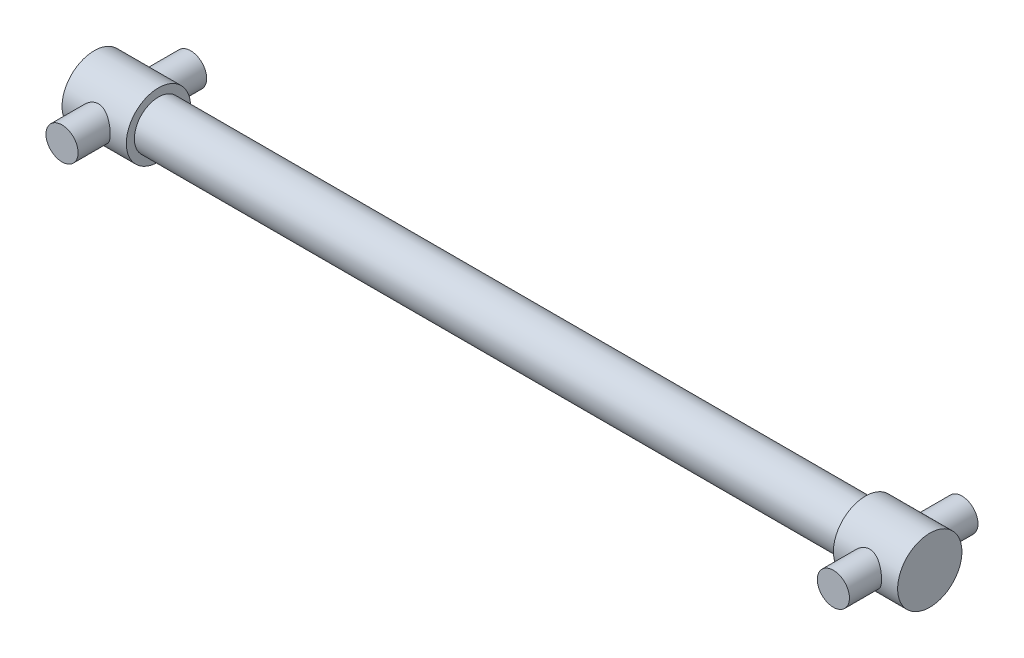
ISO-10303-21;
HEADER;
FILE_DESCRIPTION(('STEP AP214'),'2;1');
FILE_NAME('part.step','',(''),(''),'','','');
FILE_SCHEMA(('AUTOMOTIVE_DESIGN { 1 0 10303 214 1 1 1 1 }'));
ENDSEC;
DATA;
#1=APPLICATION_CONTEXT('core data for automotive mechanical design processes');
#2=APPLICATION_PROTOCOL_DEFINITION('international standard','automotive_design',2000,#1);
#3=PRODUCT_CONTEXT('',#1,'mechanical');
#4=PRODUCT('Part','Part','',(#3));
#5=PRODUCT_RELATED_PRODUCT_CATEGORY('part','',(#4));
#6=PRODUCT_DEFINITION_FORMATION('','',#4);
#7=PRODUCT_DEFINITION_CONTEXT('part definition',#1,'design');
#8=PRODUCT_DEFINITION('design','',#6,#7);
#9=PRODUCT_DEFINITION_SHAPE('','',#8);
#10=(LENGTH_UNIT() NAMED_UNIT(*) SI_UNIT(.MILLI.,.METRE.));
#11=(NAMED_UNIT(*) PLANE_ANGLE_UNIT() SI_UNIT($,.RADIAN.));
#12=(NAMED_UNIT(*) SI_UNIT($,.STERADIAN.) SOLID_ANGLE_UNIT());
#13=UNCERTAINTY_MEASURE_WITH_UNIT(LENGTH_MEASURE(1.E-05),#10,'distance_accuracy_value','');
#14=(GEOMETRIC_REPRESENTATION_CONTEXT(3) GLOBAL_UNCERTAINTY_ASSIGNED_CONTEXT((#13)) GLOBAL_UNIT_ASSIGNED_CONTEXT((#10,
#11,#12)) REPRESENTATION_CONTEXT('',''));
#15=CARTESIAN_POINT('',(0.,0.,0.));
#16=DIRECTION('',(0.,0.,1.));
#17=DIRECTION('',(1.,0.,0.));
#18=AXIS2_PLACEMENT_3D('',#15,#16,#17);
#19=CARTESIAN_POINT('',(52.,0.,0.));
#20=DIRECTION('',(-1.,0.,0.));
#21=DIRECTION('',(0.,0.,1.));
#22=AXIS2_PLACEMENT_3D('',#19,#20,#21);
#23=CYLINDRICAL_SURFACE('',#22,1.5);
#24=CARTESIAN_POINT('',(48.,0.,0.));
#25=DIRECTION('',(1.,0.,0.));
#26=DIRECTION('',(0.,0.,-1.));
#27=AXIS2_PLACEMENT_3D('',#24,#25,#26);
#28=CIRCLE('',#27,1.5);
#29=CARTESIAN_POINT('',(48.,0.,1.5));
#30=VERTEX_POINT('',#29);
#31=EDGE_CURVE('E115',#30,#30,#28,.T.);
#32=CARTESIAN_POINT('',(4.,0.,0.));
#33=DIRECTION('',(-1.,0.,0.));
#34=DIRECTION('',(0.,0.,1.));
#35=AXIS2_PLACEMENT_3D('',#32,#33,#34);
#36=CIRCLE('',#35,1.5);
#37=CARTESIAN_POINT('',(4.,0.,1.5));
#38=VERTEX_POINT('',#37);
#39=EDGE_CURVE('E89',#38,#38,#36,.T.);
#40=CARTESIAN_POINT('',(48.,0.,1.5));
#41=CARTESIAN_POINT('',(47.5416666666667,0.,1.5));
#42=CARTESIAN_POINT('',(47.0833333333333,0.,1.5));
#43=CARTESIAN_POINT('',(46.1666666666667,0.,1.5));
#44=CARTESIAN_POINT('',(45.7083333333333,0.,1.5));
#45=CARTESIAN_POINT('',(44.7916666666667,0.,1.5));
#46=CARTESIAN_POINT('',(44.3333333333333,0.,1.5));
#47=CARTESIAN_POINT('',(43.4166666666667,0.,1.5));
#48=CARTESIAN_POINT('',(42.9583333333333,0.,1.5));
#49=CARTESIAN_POINT('',(42.0416666666667,0.,1.5));
#50=CARTESIAN_POINT('',(41.5833333333333,0.,1.5));
#51=CARTESIAN_POINT('',(40.6666666666667,0.,1.5));
#52=CARTESIAN_POINT('',(40.2083333333333,0.,1.5));
#53=CARTESIAN_POINT('',(39.2916666666667,0.,1.5));
#54=CARTESIAN_POINT('',(38.8333333333333,0.,1.5));
#55=CARTESIAN_POINT('',(37.9166666666667,0.,1.5));
#56=CARTESIAN_POINT('',(37.4583333333333,0.,1.5));
#57=CARTESIAN_POINT('',(36.5416666666667,0.,1.5));
#58=CARTESIAN_POINT('',(36.0833333333333,0.,1.5));
#59=CARTESIAN_POINT('',(35.1666666666667,0.,1.5));
#60=CARTESIAN_POINT('',(34.7083333333333,0.,1.5));
#61=CARTESIAN_POINT('',(33.7916666666667,0.,1.5));
#62=CARTESIAN_POINT('',(33.3333333333333,0.,1.5));
#63=CARTESIAN_POINT('',(32.4166666666667,0.,1.5));
#64=CARTESIAN_POINT('',(31.9583333333333,0.,1.5));
#65=CARTESIAN_POINT('',(31.0416666666667,0.,1.5));
#66=CARTESIAN_POINT('',(30.5833333333333,0.,1.5));
#67=CARTESIAN_POINT('',(29.6666666666667,0.,1.5));
#68=CARTESIAN_POINT('',(29.2083333333333,0.,1.5));
#69=CARTESIAN_POINT('',(28.2916666666667,0.,1.5));
#70=CARTESIAN_POINT('',(27.8333333333333,0.,1.5));
#71=CARTESIAN_POINT('',(26.9166666666667,0.,1.5));
#72=CARTESIAN_POINT('',(26.4583333333333,0.,1.5));
#73=CARTESIAN_POINT('',(25.5416666666667,0.,1.5));
#74=CARTESIAN_POINT('',(25.0833333333333,0.,1.5));
#75=CARTESIAN_POINT('',(24.1666666666667,0.,1.5));
#76=CARTESIAN_POINT('',(23.7083333333333,0.,1.5));
#77=CARTESIAN_POINT('',(22.7916666666667,0.,1.5));
#78=CARTESIAN_POINT('',(22.3333333333333,0.,1.5));
#79=CARTESIAN_POINT('',(21.4166666666667,0.,1.5));
#80=CARTESIAN_POINT('',(20.9583333333333,0.,1.5));
#81=CARTESIAN_POINT('',(20.0416666666667,0.,1.5));
#82=CARTESIAN_POINT('',(19.5833333333333,0.,1.5));
#83=CARTESIAN_POINT('',(18.6666666666667,0.,1.5));
#84=CARTESIAN_POINT('',(18.2083333333333,0.,1.5));
#85=CARTESIAN_POINT('',(17.2916666666667,0.,1.5));
#86=CARTESIAN_POINT('',(16.8333333333333,0.,1.5));
#87=CARTESIAN_POINT('',(15.9166666666667,0.,1.5));
#88=CARTESIAN_POINT('',(15.4583333333333,0.,1.5));
#89=CARTESIAN_POINT('',(14.5416666666667,0.,1.5));
#90=CARTESIAN_POINT('',(14.0833333333333,0.,1.5));
#91=CARTESIAN_POINT('',(13.1666666666667,0.,1.5));
#92=CARTESIAN_POINT('',(12.7083333333333,0.,1.5));
#93=CARTESIAN_POINT('',(11.7916666666667,0.,1.5));
#94=CARTESIAN_POINT('',(11.3333333333333,0.,1.5));
#95=CARTESIAN_POINT('',(10.4166666666667,0.,1.5));
#96=CARTESIAN_POINT('',(9.95833333333333,0.,1.5));
#97=CARTESIAN_POINT('',(9.04166666666667,0.,1.5));
#98=CARTESIAN_POINT('',(8.58333333333333,0.,1.5));
#99=CARTESIAN_POINT('',(7.66666666666667,0.,1.5));
#100=CARTESIAN_POINT('',(7.20833333333334,0.,1.5));
#101=CARTESIAN_POINT('',(6.29166666666667,0.,1.5));
#102=CARTESIAN_POINT('',(5.83333333333334,0.,1.5));
#103=CARTESIAN_POINT('',(4.91666666666667,0.,1.5));
#104=CARTESIAN_POINT('',(4.45833333333334,0.,1.5));
#105=CARTESIAN_POINT('',(4.,0.,1.5));
#106=B_SPLINE_CURVE_WITH_KNOTS('',3,(#40,#41,#42,#43,#44,#45,#46,#47,#48,#49,#50,#51,#52,#53,
#54,#55,#56,#57,#58,#59,#60,#61,#62,#63,#64,#65,#66,#67,#68,#69,#70,#71,#72,#73,#74,#75,#76,#77,
#78,#79,#80,#81,#82,#83,#84,#85,#86,#87,#88,#89,#90,#91,#92,#93,#94,#95,#96,#97,#98,#99,#100,
#101,#102,#103,#104,#105),.UNSPECIFIED.,.F.,.F.,(4,2,2,2,2,2,2,2,2,2,2,2,2,2,2,2,2,2,2,2,2,2,2,
2,2,2,2,2,2,2,2,2,4),(0.,1.37499999999999,2.75,4.125,5.5,6.875,8.25,9.62499999999999,11.,12.375,
13.75,15.125,16.5,17.875,19.25,20.625,22.,23.375,24.75,26.125,27.5,28.875,30.25,31.625,33.,
34.375,35.75,37.125,38.5,39.875,41.25,42.625,44.),.UNSPECIFIED.);
#107=EDGE_CURVE('BSEAM30',#30,#38,#106,.T.);
#108=ORIENTED_EDGE('',*,*,#31,.F.);
#109=ORIENTED_EDGE('',*,*,#39,.F.);
#110=ORIENTED_EDGE('',*,*,#107,.T.);
#111=ORIENTED_EDGE('',*,*,#107,.F.);
#112=EDGE_LOOP('',(#108,#110,#109,#111));
#113=FACE_BOUND('',#112,.T.);
#114=ADVANCED_FACE('F30',(#113),#23,.T.);
#115=CARTESIAN_POINT('',(48.,0.,0.));
#116=DIRECTION('',(1.,0.,0.));
#117=DIRECTION('',(0.,0.,-1.));
#118=AXIS2_PLACEMENT_3D('',#115,#116,#117);
#119=CYLINDRICAL_SURFACE('',#118,2.);
#120=CARTESIAN_POINT('',(49.,0.,-2.));
#121=CARTESIAN_POINT('',(49.0000033023195,0.0525719629529863,-1.99999713404151));
#122=CARTESIAN_POINT('',(49.0041700731217,0.105206599698032,-1.99790491019518));
#123=CARTESIAN_POINT('',(49.0206528803409,0.208920235268425,-1.98974156037396));
#124=CARTESIAN_POINT('',(49.0329843929976,0.259996086713504,-1.98366287828984));
#125=CARTESIAN_POINT('',(49.0651938086168,0.358933544880574,-1.96816279403312));
#126=CARTESIAN_POINT('',(49.085042384248,0.406806802939179,-1.9587543917752));
#127=CARTESIAN_POINT('',(49.1315706213649,0.498472616806563,-1.93745776515779));
#128=CARTESIAN_POINT('',(49.1582497442488,0.542265493990048,-1.9255697363353));
#129=CARTESIAN_POINT('',(49.2195172494853,0.627507817761918,-1.89956258258057));
#130=CARTESIAN_POINT('',(49.2544864792396,0.66865521112211,-1.88535199127536));
#131=CARTESIAN_POINT('',(49.330521479247,0.744779444866975,-1.85659970246744));
#132=CARTESIAN_POINT('',(49.3715918517724,0.779751583106766,-1.84205776209035));
#133=CARTESIAN_POINT('',(49.4624833495234,0.845252000450277,-1.81298951197347));
#134=CARTESIAN_POINT('',(49.5127360983459,0.875225335551633,-1.79855186970132));
#135=CARTESIAN_POINT('',(49.6183673359862,0.926168226890691,-1.77285978772321));
#136=CARTESIAN_POINT('',(49.6737421287228,0.94714421496633,-1.7616030760699));
#137=CARTESIAN_POINT('',(49.7846651054219,0.978132442188585,-1.74457867037809));
#138=CARTESIAN_POINT('',(49.8400044520674,0.988725857080438,-1.73852271583714));
#139=CARTESIAN_POINT('',(49.9519788377795,1.00042699330884,-1.73181889948528));
#140=CARTESIAN_POINT('',(50.0086125408711,1.00154408837307,-1.73116569343288));
#141=CARTESIAN_POINT('',(50.1142860243154,0.994687287172293,-1.73510930257249));
#142=CARTESIAN_POINT('',(50.163424031223,0.987784559536821,-1.73908763662014));
#143=CARTESIAN_POINT('',(50.259721909373,0.966939849056932,-1.7507622873385));
#144=CARTESIAN_POINT('',(50.3068811453053,0.95299562389765,-1.75845978831776));
#145=CARTESIAN_POINT('',(50.3992291325657,0.918209780386001,-1.77687476412741));
#146=CARTESIAN_POINT('',(50.4443463987858,0.897215067115992,-1.78765840663999));
#147=CARTESIAN_POINT('',(50.53063429259,0.849041687668,-1.81103404281404));
#148=CARTESIAN_POINT('',(50.5718031356001,0.821860243812465,-1.82362684780191));
#149=CARTESIAN_POINT('',(50.6545212527432,0.758066054912787,-1.85113157903286));
#150=CARTESIAN_POINT('',(50.6954568735761,0.720694458369282,-1.86613510236746));
#151=CARTESIAN_POINT('',(50.7707354185909,0.639555578741376,-1.89547623300407));
#152=CARTESIAN_POINT('',(50.8050751920339,0.595785256574287,-1.90981351958801));
#153=CARTESIAN_POINT('',(50.8676856610297,0.500516505831849,-1.93701987282964));
#154=CARTESIAN_POINT('',(50.8956004724457,0.448753591599409,-1.94978984162007));
#155=CARTESIAN_POINT('',(50.942097029043,0.340466215488798,-1.97157881121242));
#156=CARTESIAN_POINT('',(50.9606861850152,0.283945576265278,-1.98060078943553));
#157=CARTESIAN_POINT('',(50.9864754037167,0.172766491660704,-1.99324333741436));
#158=CARTESIAN_POINT('',(50.9944912357468,0.118341530548326,-1.99724938301312));
#159=CARTESIAN_POINT('',(51.0014647311345,0.00877959994935483,-2.00073013459102));
#160=CARTESIAN_POINT('',(51.0004266856395,-0.0463570198699006,-2.00020698721312));
#161=CARTESIAN_POINT('',(50.9897933115812,-0.151232971985993,-1.99491192253441));
#162=CARTESIAN_POINT('',(50.98086746727,-0.201059408049954,-1.9904724568819));
#163=CARTESIAN_POINT('',(50.9557619281049,-0.298406892301916,-1.97822171314819));
#164=CARTESIAN_POINT('',(50.9395814335466,-0.345927685690995,-1.97041006334332));
#165=CARTESIAN_POINT('',(50.9000015335668,-0.438888608449664,-1.95184251413669));
#166=CARTESIAN_POINT('',(50.8764089498832,-0.484230397006153,-1.94100881769939));
#167=CARTESIAN_POINT('',(50.822892464354,-0.57046136169892,-1.91743974317109));
#168=CARTESIAN_POINT('',(50.7929658654066,-0.611348629775279,-1.90470355565785));
#169=CARTESIAN_POINT('',(50.7242395746671,-0.691767689290649,-1.87708221337465));
#170=CARTESIAN_POINT('',(50.6848571315464,-0.730772077824635,-1.86210884848441));
#171=CARTESIAN_POINT('',(50.6000748487307,-0.801856321113236,-1.83262391603875));
#172=CARTESIAN_POINT('',(50.5546708811836,-0.833931385690837,-1.81811267381527));
#173=CARTESIAN_POINT('',(50.4563563457997,-0.891707914497692,-1.79051192226068));
#174=CARTESIAN_POINT('',(50.4031887337914,-0.917025495878634,-1.77752529663472));
#175=CARTESIAN_POINT('',(50.2924899323075,-0.958082826013801,-1.75574072368126));
#176=CARTESIAN_POINT('',(50.2349644734988,-0.973834915887568,-1.74693738240618));
#177=CARTESIAN_POINT('',(50.1230897771385,-0.993861687449677,-1.73561501008667));
#178=CARTESIAN_POINT('',(50.068965746571,-0.999092996400863,-1.73257383460491));
#179=CARTESIAN_POINT('',(49.9605529328293,-1.00068915438078,-1.73165354646175));
#180=CARTESIAN_POINT('',(49.9062642312606,-0.997057846624396,-1.73377219627553));
#181=CARTESIAN_POINT('',(49.804516498468,-0.98192612559226,-1.74237862050025));
#182=CARTESIAN_POINT('',(49.7568995298556,-0.971208314342796,-1.74843094482394));
#183=CARTESIAN_POINT('',(49.6641918805753,-0.943175358224643,-1.76371016187918));
#184=CARTESIAN_POINT('',(49.619102017908,-0.925858091159809,-1.77293807569676));
#185=CARTESIAN_POINT('',(49.5293751490134,-0.883815745300679,-1.79428530364528));
#186=CARTESIAN_POINT('',(49.4849720981703,-0.858671137816451,-1.80655722396191));
#187=CARTESIAN_POINT('',(49.4007254638194,-0.802150971636627,-1.83235331634591));
#188=CARTESIAN_POINT('',(49.3608842694815,-0.770772171238644,-1.84587813794522));
#189=CARTESIAN_POINT('',(49.2818580176424,-0.698203326664641,-1.87462323159313));
#190=CARTESIAN_POINT('',(49.2433408976381,-0.656284423010171,-1.88984983311469));
#191=CARTESIAN_POINT('',(49.1737370165764,-0.566154806220278,-1.91877752255088));
#192=CARTESIAN_POINT('',(49.1426542605737,-0.517940723256783,-1.9324777860804));
#193=CARTESIAN_POINT('',(49.0887636372378,-0.415931596819943,-1.95698009585103));
#194=CARTESIAN_POINT('',(49.0660158305886,-0.36209950393461,-1.96776096562909));
#195=CARTESIAN_POINT('',(49.030191832081,-0.250742101294186,-1.98501341363466));
#196=CARTESIAN_POINT('',(49.0170881531704,-0.193227799623161,-1.99149723372932));
#197=CARTESIAN_POINT('',(49.0061025889242,-0.11260194648338,-1.99695461909663));
#198=CARTESIAN_POINT('',(49.0038173591364,-0.0901618794394953,-1.99809365339202));
#199=CARTESIAN_POINT('',(49.0007653344832,-0.0451517318071558,-1.99961696977865));
#200=CARTESIAN_POINT('',(48.9999985815288,-0.0225816476473804,-2.00000123103763));
#201=CARTESIAN_POINT('',(49.,0.,-2.));
#202=B_SPLINE_CURVE_WITH_KNOTS('',3,(#120,#121,#122,#123,#124,#125,#126,#127,#128,#129,#130,
#131,#132,#133,#134,#135,#136,#137,#138,#139,#140,#141,#142,#143,#144,#145,#146,#147,#148,#149,
#150,#151,#152,#153,#154,#155,#156,#157,#158,#159,#160,#161,#162,#163,#164,#165,#166,#167,#168,
#169,#170,#171,#172,#173,#174,#175,#176,#177,#178,#179,#180,#181,#182,#183,#184,#185,#186,#187,
#188,#189,#190,#191,#192,#193,#194,#195,#196,#197,#198,#199,#200,#201),.UNSPECIFIED.,.T.,.F.,(4,
2,2,2,2,2,2,2,2,2,2,2,2,2,2,2,2,2,2,2,2,2,2,2,2,2,2,2,2,2,2,2,2,2,2,2,2,2,2,2,4),(0.,
0.157624257420292,0.315548149709196,0.472862155492299,0.630163760581564,0.79698175871809,
0.963926237654031,1.14381726430752,1.32357947898281,1.49258012140228,1.66141357329019,
1.8100571240932,1.95874803925678,2.11090240168487,2.26312521260221,2.43464941333877,
2.60625534598685,2.7858302221444,2.96526216912279,3.12983290471345,3.29432564511475,
3.44606906506121,3.59782921630931,3.75392856027898,3.91009450748338,4.08159610644417,
4.2532158861543,4.43314682159673,4.61284511940776,4.77529307498373,4.93767059860004,
5.08457930244181,5.23153528783677,5.38836456775614,5.54527561138956,5.72125242752497,
5.89732383376572,6.07464013662924,6.25144908624929,6.31915280137696,6.38685838514845),.UNSPECIFIED.);
#203=CARTESIAN_POINT('',(49.,0.,-2.));
#204=VERTEX_POINT('',#203);
#205=EDGE_CURVE('E44',#204,#204,#202,.T.);
#206=ORIENTED_EDGE('',*,*,#205,.F.);
#207=EDGE_LOOP('',(#206));
#208=FACE_BOUND('',#207,.T.);
#209=CARTESIAN_POINT('',(51.,0.,2.));
#210=CARTESIAN_POINT('',(50.9999966976805,0.0525719629529863,1.99999713404151));
#211=CARTESIAN_POINT('',(50.9958299268783,0.105206599698032,1.99790491019518));
#212=CARTESIAN_POINT('',(50.9793471196591,0.208920235268425,1.98974156037396));
#213=CARTESIAN_POINT('',(50.9670156070023,0.259996086713504,1.98366287828984));
#214=CARTESIAN_POINT('',(50.9348061913832,0.358933544880574,1.96816279403312));
#215=CARTESIAN_POINT('',(50.914957615752,0.406806802939179,1.9587543917752));
#216=CARTESIAN_POINT('',(50.8684293786351,0.498472616806563,1.93745776515779));
#217=CARTESIAN_POINT('',(50.8417502557511,0.542265493990048,1.9255697363353));
#218=CARTESIAN_POINT('',(50.7804827505147,0.627507817761918,1.89956258258057));
#219=CARTESIAN_POINT('',(50.7455135207603,0.66865521112211,1.88535199127536));
#220=CARTESIAN_POINT('',(50.669478520753,0.744779444866975,1.85659970246744));
#221=CARTESIAN_POINT('',(50.6284081482276,0.779751583106765,1.84205776209035));
#222=CARTESIAN_POINT('',(50.5375166504766,0.845252000450278,1.81298951197347));
#223=CARTESIAN_POINT('',(50.4872639016541,0.875225335551636,1.79855186970132));
#224=CARTESIAN_POINT('',(50.3816326640138,0.926168226890693,1.77285978772321));
#225=CARTESIAN_POINT('',(50.3262578712772,0.947144214966331,1.7616030760699));
#226=CARTESIAN_POINT('',(50.2153348945781,0.978132442188585,1.74457867037809));
#227=CARTESIAN_POINT('',(50.1599955479326,0.988725857080439,1.73852271583714));
#228=CARTESIAN_POINT('',(50.0480211622205,1.00042699330884,1.73181889948528));
#229=CARTESIAN_POINT('',(49.9913874591289,1.00154408837307,1.73116569343288));
#230=CARTESIAN_POINT('',(49.8857139756846,0.994687287172293,1.73510930257249));
#231=CARTESIAN_POINT('',(49.8365759687769,0.987784559536821,1.73908763662014));
#232=CARTESIAN_POINT('',(49.740278090627,0.966939849056932,1.7507622873385));
#233=CARTESIAN_POINT('',(49.6931188546947,0.95299562389765,1.75845978831776));
#234=CARTESIAN_POINT('',(49.6007708674343,0.918209780386001,1.77687476412741));
#235=CARTESIAN_POINT('',(49.5556536012142,0.897215067115992,1.78765840663999));
#236=CARTESIAN_POINT('',(49.46936570741,0.849041687668,1.81103404281404));
#237=CARTESIAN_POINT('',(49.4281968643999,0.821860243812465,1.82362684780191));
#238=CARTESIAN_POINT('',(49.3454787472568,0.758066054912787,1.85113157903286));
#239=CARTESIAN_POINT('',(49.3045431264238,0.720694458369282,1.86613510236746));
#240=CARTESIAN_POINT('',(49.2292645814091,0.639555578741376,1.89547623300407));
#241=CARTESIAN_POINT('',(49.1949248079661,0.595785256574287,1.90981351958801));
#242=CARTESIAN_POINT('',(49.1323143389703,0.500516505831849,1.93701987282964));
#243=CARTESIAN_POINT('',(49.1043995275543,0.448753591599409,1.94978984162007));
#244=CARTESIAN_POINT('',(49.057902970957,0.340466215488798,1.97157881121242));
#245=CARTESIAN_POINT('',(49.0393138149848,0.283945576265278,1.98060078943553));
#246=CARTESIAN_POINT('',(49.0135245962833,0.172766491660704,1.99324333741436));
#247=CARTESIAN_POINT('',(49.0055087642532,0.118341530548326,1.99724938301312));
#248=CARTESIAN_POINT('',(48.9985352688655,0.00877959994935484,2.00073013459102));
#249=CARTESIAN_POINT('',(48.9995733143605,-0.0463570198699005,2.00020698721312));
#250=CARTESIAN_POINT('',(49.0102066884188,-0.151232971985993,1.99491192253441));
#251=CARTESIAN_POINT('',(49.01913253273,-0.201059408049954,1.9904724568819));
#252=CARTESIAN_POINT('',(49.0442380718951,-0.298406892301916,1.97822171314819));
#253=CARTESIAN_POINT('',(49.0604185664534,-0.345927685690995,1.97041006334333));
#254=CARTESIAN_POINT('',(49.0999984664332,-0.438888608449662,1.9518425141367));
#255=CARTESIAN_POINT('',(49.1235910501168,-0.48423039700615,1.94100881769939));
#256=CARTESIAN_POINT('',(49.177107535646,-0.570461361698916,1.91743974317109));
#257=CARTESIAN_POINT('',(49.2070341345934,-0.611348629775277,1.90470355565785));
#258=CARTESIAN_POINT('',(49.2757604253329,-0.69176768929065,1.87708221337465));
#259=CARTESIAN_POINT('',(49.3151428684536,-0.730772077824638,1.86210884848441));
#260=CARTESIAN_POINT('',(49.3999251512693,-0.801856321113238,1.83262391603874));
#261=CARTESIAN_POINT('',(49.4453291188164,-0.833931385690838,1.81811267381526));
#262=CARTESIAN_POINT('',(49.5436436542003,-0.891707914497692,1.79051192226068));
#263=CARTESIAN_POINT('',(49.5968112662086,-0.917025495878634,1.77752529663472));
#264=CARTESIAN_POINT('',(49.7075100676925,-0.958082826013801,1.75574072368126));
#265=CARTESIAN_POINT('',(49.7650355265012,-0.973834915887568,1.74693738240618));
#266=CARTESIAN_POINT('',(49.8769102228614,-0.993861687449677,1.73561501008667));
#267=CARTESIAN_POINT('',(49.931034253429,-0.999092996400863,1.73257383460491));
#268=CARTESIAN_POINT('',(50.0394470671707,-1.00068915438078,1.73165354646175));
#269=CARTESIAN_POINT('',(50.0937357687394,-0.997057846624396,1.73377219627553));
#270=CARTESIAN_POINT('',(50.195483501532,-0.98192612559226,1.74237862050025));
#271=CARTESIAN_POINT('',(50.2431004701444,-0.971208314342796,1.74843094482394));
#272=CARTESIAN_POINT('',(50.3358081194247,-0.943175358224641,1.76371016187918));
#273=CARTESIAN_POINT('',(50.380897982092,-0.925858091159807,1.77293807569676));
#274=CARTESIAN_POINT('',(50.4706248509866,-0.883815745300682,1.79428530364528));
#275=CARTESIAN_POINT('',(50.5150279018297,-0.858671137816459,1.80655722396191));
#276=CARTESIAN_POINT('',(50.5992745361806,-0.802150971636636,1.8323533163459));
#277=CARTESIAN_POINT('',(50.6391157305185,-0.770772171238649,1.84587813794522));
#278=CARTESIAN_POINT('',(50.7181419823576,-0.69820332666464,1.87462323159313));
#279=CARTESIAN_POINT('',(50.7566591023619,-0.65628442301017,1.88984983311469));
#280=CARTESIAN_POINT('',(50.8262629834236,-0.566154806220278,1.91877752255088));
#281=CARTESIAN_POINT('',(50.8573457394263,-0.517940723256783,1.9324777860804));
#282=CARTESIAN_POINT('',(50.9112363627622,-0.415931596819944,1.95698009585103));
#283=CARTESIAN_POINT('',(50.9339841694114,-0.362099503934611,1.96776096562909));
#284=CARTESIAN_POINT('',(50.9698081679189,-0.250742101294187,1.98501341363466));
#285=CARTESIAN_POINT('',(50.9829118468296,-0.193227799623162,1.99149723372932));
#286=CARTESIAN_POINT('',(50.9938974110758,-0.11260194648338,1.99695461909663));
#287=CARTESIAN_POINT('',(50.9961826408636,-0.0901618794394953,1.99809365339202));
#288=CARTESIAN_POINT('',(50.9992346655168,-0.0451517318071558,1.99961696977865));
#289=CARTESIAN_POINT('',(51.0000014184712,-0.0225816476473804,2.00000123103763));
#290=CARTESIAN_POINT('',(51.,0.,2.));
#291=B_SPLINE_CURVE_WITH_KNOTS('',3,(#209,#210,#211,#212,#213,#214,#215,#216,#217,#218,#219,
#220,#221,#222,#223,#224,#225,#226,#227,#228,#229,#230,#231,#232,#233,#234,#235,#236,#237,#238,
#239,#240,#241,#242,#243,#244,#245,#246,#247,#248,#249,#250,#251,#252,#253,#254,#255,#256,#257,
#258,#259,#260,#261,#262,#263,#264,#265,#266,#267,#268,#269,#270,#271,#272,#273,#274,#275,#276,
#277,#278,#279,#280,#281,#282,#283,#284,#285,#286,#287,#288,#289,#290),.UNSPECIFIED.,.T.,.F.,(4,
2,2,2,2,2,2,2,2,2,2,2,2,2,2,2,2,2,2,2,2,2,2,2,2,2,2,2,2,2,2,2,2,2,2,2,2,2,2,2,4),(0.,
0.157624257420292,0.315548149709196,0.472862155492299,0.630163760581564,0.79698175871809,
0.963926237654031,1.14381726430752,1.32357947898281,1.49258012140229,1.66141357329019,
1.8100571240932,1.95874803925678,2.11090240168487,2.26312521260221,2.43464941333877,
2.60625534598685,2.7858302221444,2.96526216912279,3.12983290471345,3.29432564511475,
3.44606906506121,3.59782921630931,3.75392856027897,3.91009450748338,4.08159610644418,
4.2532158861543,4.43314682159673,4.61284511940777,4.77529307498373,4.93767059860004,
5.08457930244182,5.23153528783677,5.38836456775612,5.54527561138956,5.72125242752497,
5.89732383376572,6.07464013662924,6.25144908624929,6.31915280137697,6.38685838514846),.UNSPECIFIED.);
#292=CARTESIAN_POINT('',(51.,0.,2.));
#293=VERTEX_POINT('',#292);
#294=EDGE_CURVE('E48',#293,#293,#291,.T.);
#295=ORIENTED_EDGE('',*,*,#294,.F.);
#296=EDGE_LOOP('',(#295));
#297=FACE_BOUND('',#296,.T.);
#298=CARTESIAN_POINT('',(48.,0.,0.));
#299=DIRECTION('',(1.,0.,0.));
#300=DIRECTION('',(0.,0.,-1.));
#301=AXIS2_PLACEMENT_3D('',#298,#299,#300);
#302=CIRCLE('',#301,2.);
#303=CARTESIAN_POINT('',(48.,0.,-2.));
#304=VERTEX_POINT('',#303);
#305=EDGE_CURVE('E118',#304,#304,#302,.T.);
#306=ORIENTED_EDGE('',*,*,#305,.T.);
#307=EDGE_LOOP('',(#306));
#308=FACE_BOUND('',#307,.T.);
#309=CARTESIAN_POINT('',(52.,0.,0.));
#310=DIRECTION('',(1.,0.,0.));
#311=DIRECTION('',(0.,0.,-1.));
#312=AXIS2_PLACEMENT_3D('',#309,#310,#311);
#313=CIRCLE('',#312,2.);
#314=CARTESIAN_POINT('',(52.,0.,-2.));
#315=VERTEX_POINT('',#314);
#316=EDGE_CURVE('E121',#315,#315,#313,.T.);
#317=ORIENTED_EDGE('',*,*,#316,.F.);
#318=EDGE_LOOP('',(#317));
#319=FACE_BOUND('',#318,.T.);
#320=ADVANCED_FACE('F91',(#208,#297,#308,#319),#119,.T.);
#321=CARTESIAN_POINT('',(48.,0.,0.));
#322=DIRECTION('',(1.,0.,0.));
#323=DIRECTION('',(0.,0.,-1.));
#324=AXIS2_PLACEMENT_3D('',#321,#322,#323);
#325=PLANE('',#324);
#326=ORIENTED_EDGE('',*,*,#31,.T.);
#327=EDGE_LOOP('',(#326));
#328=FACE_BOUND('',#327,.T.);
#329=ORIENTED_EDGE('',*,*,#305,.F.);
#330=EDGE_LOOP('',(#329));
#331=FACE_BOUND('',#330,.T.);
#332=ADVANCED_FACE('F95',(#328,#331),#325,.F.);
#333=CARTESIAN_POINT('',(52.,0.,0.));
#334=DIRECTION('',(1.,0.,0.));
#335=DIRECTION('',(0.,0.,-1.));
#336=AXIS2_PLACEMENT_3D('',#333,#334,#335);
#337=PLANE('',#336);
#338=ORIENTED_EDGE('',*,*,#316,.T.);
#339=EDGE_LOOP('',(#338));
#340=FACE_BOUND('',#339,.T.);
#341=ADVANCED_FACE('F97',(#340),#337,.T.);
#342=CARTESIAN_POINT('',(4.,0.,0.));
#343=DIRECTION('',(-1.,0.,0.));
#344=DIRECTION('',(0.,0.,1.));
#345=AXIS2_PLACEMENT_3D('',#342,#343,#344);
#346=CYLINDRICAL_SURFACE('',#345,2.);
#347=CARTESIAN_POINT('',(2.99999999999999,0.,2.));
#348=CARTESIAN_POINT('',(2.99999669768048,0.0525719629529881,1.99999713404151));
#349=CARTESIAN_POINT('',(2.99582992687828,0.105206599698034,1.99790491019518));
#350=CARTESIAN_POINT('',(2.979347119659,0.208920235268425,1.98974156037396));
#351=CARTESIAN_POINT('',(2.96701560700225,0.259996086713501,1.98366287828984));
#352=CARTESIAN_POINT('',(2.93480619138307,0.358933544880564,1.96816279403312));
#353=CARTESIAN_POINT('',(2.91495761575184,0.406806802939164,1.95875439177521));
#354=CARTESIAN_POINT('',(2.86842937863488,0.498472616806537,1.93745776515779));
#355=CARTESIAN_POINT('',(2.84175025575095,0.542265493990014,1.92556973633531));
#356=CARTESIAN_POINT('',(2.78048275051447,0.627507817761866,1.89956258258059));
#357=CARTESIAN_POINT('',(2.74551352076011,0.668655211122049,1.88535199127538));
#358=CARTESIAN_POINT('',(2.66947852075268,0.744779444866892,1.85659970246748));
#359=CARTESIAN_POINT('',(2.62840814822726,0.779751583106668,1.84205776209039));
#360=CARTESIAN_POINT('',(2.53751665047629,0.845252000450148,1.81298951197353));
#361=CARTESIAN_POINT('',(2.48726390165375,0.875225335551487,1.79855186970139));
#362=CARTESIAN_POINT('',(2.38163266401342,0.926168226890505,1.7728597877233));
#363=CARTESIAN_POINT('',(2.32625787127688,0.947144214966122,1.76160307607001));
#364=CARTESIAN_POINT('',(2.2153348945777,0.978132442188332,1.74457867037823));
#365=CARTESIAN_POINT('',(2.15999554793224,0.988725857080162,1.73852271583729));
#366=CARTESIAN_POINT('',(2.04802116222016,1.00042699330853,1.73181889948546));
#367=CARTESIAN_POINT('',(1.99138745912849,1.00154408837273,1.73116569343308));
#368=CARTESIAN_POINT('',(1.88571397568429,0.994687287171919,1.7351093025727));
#369=CARTESIAN_POINT('',(1.83657596877661,0.987784559536429,1.73908763662036));
#370=CARTESIAN_POINT('',(1.74027809062663,0.966939849056507,1.75076228733874));
#371=CARTESIAN_POINT('',(1.69311885469436,0.952995623897211,1.758459788318));
#372=CARTESIAN_POINT('',(1.60077086743402,0.918209780385528,1.77687476412766));
#373=CARTESIAN_POINT('',(1.55565360121389,0.897215067115499,1.78765840664023));
#374=CARTESIAN_POINT('',(1.46936570740967,0.849041687667465,1.81103404281429));
#375=CARTESIAN_POINT('',(1.42819686439959,0.821860243811909,1.82362684780216));
#376=CARTESIAN_POINT('',(1.34547874725646,0.758066054912186,1.85113157903311));
#377=CARTESIAN_POINT('',(1.30454312642354,0.720694458368656,1.8661351023677));
#378=CARTESIAN_POINT('',(1.22926458140882,0.639555578740703,1.8954762330043));
#379=CARTESIAN_POINT('',(1.19492480796585,0.595785256573592,1.90981351958823));
#380=CARTESIAN_POINT('',(1.13231433897004,0.500516505831121,1.93701987282983));
#381=CARTESIAN_POINT('',(1.10439952755406,0.448753591598671,1.94978984162024));
#382=CARTESIAN_POINT('',(1.05790297095684,0.340466215488045,1.97157881121255));
#383=CARTESIAN_POINT('',(1.03931381498471,0.28394557626452,1.98060078943563));
#384=CARTESIAN_POINT('',(1.01352459628325,0.172766491659948,1.99324333741443));
#385=CARTESIAN_POINT('',(1.00550876425317,0.118341530547578,1.99724938301316));
#386=CARTESIAN_POINT('',(0.998535268865504,0.00877959994862709,2.00073013459102));
#387=CARTESIAN_POINT('',(0.999573314360536,-0.0463570198706153,2.00020698721311));
#388=CARTESIAN_POINT('',(1.01020668841881,-0.151232971986687,1.99491192253436));
#389=CARTESIAN_POINT('',(1.0191325327301,-0.201059408050641,1.99047245688183));
#390=CARTESIAN_POINT('',(1.04423807189519,-0.298406892302585,1.97822171314809));
#391=CARTESIAN_POINT('',(1.06041856645347,-0.345927685691655,1.97041006334321));
#392=CARTESIAN_POINT('',(1.09999846643332,-0.438888608450309,1.95184251413655));
#393=CARTESIAN_POINT('',(1.12359105011698,-0.484230397006793,1.94100881769923));
#394=CARTESIAN_POINT('',(1.17710753564624,-0.570461361699548,1.9174397431709));
#395=CARTESIAN_POINT('',(1.20703413459365,-0.611348629775902,1.90470355565765));
#396=CARTESIAN_POINT('',(1.27576042533313,-0.691767689291257,1.87708221337442));
#397=CARTESIAN_POINT('',(1.31514286845384,-0.730772077825234,1.86210884848418));
#398=CARTESIAN_POINT('',(1.39992515126962,-0.801856321113812,1.83262391603849));
#399=CARTESIAN_POINT('',(1.44532911881671,-0.833931385691401,1.81811267381501));
#400=CARTESIAN_POINT('',(1.54364365420068,-0.891707914498221,1.79051192226042));
#401=CARTESIAN_POINT('',(1.59681126620898,-0.917025495879141,1.77752529663446));
#402=CARTESIAN_POINT('',(1.70751006769293,-0.958082826014262,1.75574072368101));
#403=CARTESIAN_POINT('',(1.7650355265016,-0.973834915888005,1.74693738240594));
#404=CARTESIAN_POINT('',(1.87691022286187,-0.993861687450064,1.73561501008645));
#405=CARTESIAN_POINT('',(1.93103425342944,-0.999092996401226,1.7325738346047));
#406=CARTESIAN_POINT('',(2.03944706717111,-1.0006891543811,1.73165354646157));
#407=CARTESIAN_POINT('',(2.09373576873981,-0.997057846624696,1.73377219627535));
#408=CARTESIAN_POINT('',(2.19548350153236,-0.981926125592526,1.7423786205001));
#409=CARTESIAN_POINT('',(2.24310047014474,-0.971208314343047,1.7484309448238));
#410=CARTESIAN_POINT('',(2.33580811942502,-0.943175358224866,1.76371016187906));
#411=CARTESIAN_POINT('',(2.38089798209226,-0.925858091160019,1.77293807569665));
#412=CARTESIAN_POINT('',(2.47062485098688,-0.883815745300866,1.79428530364519));
#413=CARTESIAN_POINT('',(2.51502790182997,-0.858671137816625,1.80655722396183));
#414=CARTESIAN_POINT('',(2.59927453618084,-0.802150971636772,1.83235331634584));
#415=CARTESIAN_POINT('',(2.63911573051874,-0.770772171238772,1.84587813794517));
#416=CARTESIAN_POINT('',(2.71814198235784,-0.698203326664734,1.8746232315931));
#417=CARTESIAN_POINT('',(2.75665910236214,-0.656284423010247,1.88984983311466));
#418=CARTESIAN_POINT('',(2.82626298342383,-0.566154806220323,1.91877752255086));
#419=CARTESIAN_POINT('',(2.85734573942647,-0.517940723256813,1.93247778608039));
#420=CARTESIAN_POINT('',(2.91123636276235,-0.41593159681995,1.95698009585103));
#421=CARTESIAN_POINT('',(2.93398416941156,-0.362099503934609,1.96776096562909));
#422=CARTESIAN_POINT('',(2.96980816791904,-0.250742101294172,1.98501341363466));
#423=CARTESIAN_POINT('',(2.98291184682964,-0.193227799623141,1.99149723372932));
#424=CARTESIAN_POINT('',(2.99389741107588,-0.11260194648336,1.99695461909663));
#425=CARTESIAN_POINT('',(2.99618264086364,-0.0901618794394791,1.99809365339202));
#426=CARTESIAN_POINT('',(2.99923466551681,-0.0451517318071474,1.99961696977865));
#427=CARTESIAN_POINT('',(3.0000014184712,-0.0225816476473762,2.00000123103763));
#428=CARTESIAN_POINT('',(2.99999999999999,0.,2.));
#429=B_SPLINE_CURVE_WITH_KNOTS('',3,(#347,#348,#349,#350,#351,#352,#353,#354,#355,#356,#357,
#358,#359,#360,#361,#362,#363,#364,#365,#366,#367,#368,#369,#370,#371,#372,#373,#374,#375,#376,
#377,#378,#379,#380,#381,#382,#383,#384,#385,#386,#387,#388,#389,#390,#391,#392,#393,#394,#395,
#396,#397,#398,#399,#400,#401,#402,#403,#404,#405,#406,#407,#408,#409,#410,#411,#412,#413,#414,
#415,#416,#417,#418,#419,#420,#421,#422,#423,#424,#425,#426,#427,#428),.UNSPECIFIED.,.T.,.F.,(4,
2,2,2,2,2,2,2,2,2,2,2,2,2,2,2,2,2,2,2,2,2,2,2,2,2,2,2,2,2,2,2,2,2,2,2,2,2,2,2,4),(0.,
0.157624257420297,0.315548149709208,0.472862155492314,0.630163760581588,0.796981758718116,
0.963926237654069,1.14381726430755,1.32357947898282,1.49258012140228,1.66141357329017,
1.81005712409317,1.95874803925675,2.11090240168487,2.26312521260225,2.43464941333883,
2.60625534598693,2.78583022214446,2.96526216912282,3.12983290471345,3.29432564511472,
3.44606906506117,3.59782921630926,3.75392856027895,3.91009450748337,4.0815961064442,
4.25321588615436,4.43314682159679,4.61284511940783,4.77529307498376,4.93767059860004,
5.0845793024418,5.23153528783673,5.3883645677561,5.54527561138955,5.72125242752498,
5.89732383376574,6.07464013662927,6.25144908624932,6.31915280137698,6.38685838514846),.UNSPECIFIED.);
#430=CARTESIAN_POINT('',(2.99999999999999,0.,2.));
#431=VERTEX_POINT('',#430);
#432=EDGE_CURVE('E10',#431,#431,#429,.T.);
#433=ORIENTED_EDGE('',*,*,#432,.F.);
#434=EDGE_LOOP('',(#433));
#435=FACE_BOUND('',#434,.T.);
#436=CARTESIAN_POINT('',(2.99999999999999,-3.35182208528941E-13,-2.));
#437=CARTESIAN_POINT('',(2.99999669768049,-0.0525719629533238,-1.9999971340415));
#438=CARTESIAN_POINT('',(2.99582992687832,-0.105206599698372,-1.99790491019516));
#439=CARTESIAN_POINT('',(2.97934711965907,-0.208920235268767,-1.98974156037393));
#440=CARTESIAN_POINT('',(2.96701560700234,-0.259996086713847,-1.98366287828979));
#441=CARTESIAN_POINT('',(2.93480619138319,-0.358933544880919,-1.96816279403305));
#442=CARTESIAN_POINT('',(2.91495761575198,-0.406806802939524,-1.95875439177513));
#443=CARTESIAN_POINT('',(2.86842937863505,-0.49847261680691,-1.9374577651577));
#444=CARTESIAN_POINT('',(2.84175025575113,-0.542265493990394,-1.9255697363352));
#445=CARTESIAN_POINT('',(2.78048275051469,-0.627507817762265,-1.89956258258046));
#446=CARTESIAN_POINT('',(2.74551352076034,-0.668655211122459,-1.88535199127524));
#447=CARTESIAN_POINT('',(2.66947852075294,-0.744779444867326,-1.8565997024673));
#448=CARTESIAN_POINT('',(2.62840814822753,-0.779751583107115,-1.8420577620902));
#449=CARTESIAN_POINT('',(2.53751665047659,-0.845252000450628,-1.81298951197331));
#450=CARTESIAN_POINT('',(2.48726390165405,-0.875225335551986,-1.79855186970115));
#451=CARTESIAN_POINT('',(2.38163266401374,-0.926168226891044,-1.77285978772302));
#452=CARTESIAN_POINT('',(2.32625787127721,-0.947144214966681,-1.76160307606971));
#453=CARTESIAN_POINT('',(2.21533489457803,-0.978132442188931,-1.74457867037789));
#454=CARTESIAN_POINT('',(2.15999554793256,-0.988725857080781,-1.73852271583694));
#455=CARTESIAN_POINT('',(2.04802116222048,-1.00042699330918,-1.73181889948508));
#456=CARTESIAN_POINT('',(1.9913874591288,-1.00154408837341,-1.73116569343269));
#457=CARTESIAN_POINT('',(1.88571397568459,-0.994687287172623,-1.7351093025723));
#458=CARTESIAN_POINT('',(1.83657596877692,-0.987784559537149,-1.73908763661995));
#459=CARTESIAN_POINT('',(1.74027809062694,-0.96693984905726,-1.75076228733832));
#460=CARTESIAN_POINT('',(1.69311885469467,-0.952995623897981,-1.75845978831758));
#461=CARTESIAN_POINT('',(1.60077086743433,-0.918209780386336,-1.77687476412724));
#462=CARTESIAN_POINT('',(1.55565360121421,-0.897215067116329,-1.78765840663982));
#463=CARTESIAN_POINT('',(1.46936570741,-0.849041687668342,-1.81103404281388));
#464=CARTESIAN_POINT('',(1.42819686439992,-0.821860243812811,-1.82362684780175));
#465=CARTESIAN_POINT('',(1.34547874725679,-0.758066054913138,-1.85113157903272));
#466=CARTESIAN_POINT('',(1.30454312642386,-0.720694458369633,-1.86613510236733));
#467=CARTESIAN_POINT('',(1.22926458140911,-0.639555578741729,-1.89547623300395));
#468=CARTESIAN_POINT('',(1.19492480796613,-0.595785256574643,-1.9098135195879));
#469=CARTESIAN_POINT('',(1.13231433897028,-0.500516505832208,-1.93701987282955));
#470=CARTESIAN_POINT('',(1.10439952755427,-0.448753591599767,-1.94978984161999));
#471=CARTESIAN_POINT('',(1.05790297095699,-0.340466215489151,-1.97157881121236));
#472=CARTESIAN_POINT('',(1.03931381498483,-0.283945576265628,-1.98060078943548));
#473=CARTESIAN_POINT('',(1.01352459628332,-0.172766491661047,-1.99324333741433));
#474=CARTESIAN_POINT('',(1.00550876425322,-0.118341530548666,-1.9972493830131));
#475=CARTESIAN_POINT('',(0.998535268865506,-0.0087795999496882,-2.00073013459102));
#476=CARTESIAN_POINT('',(0.999573314360518,0.046357019869571,-2.00020698721313));
#477=CARTESIAN_POINT('',(1.01020668841875,0.151232971985669,-1.99491192253443));
#478=CARTESIAN_POINT('',(1.01913253273003,0.201059408049631,-1.99047245688193));
#479=CARTESIAN_POINT('',(1.04423807189509,0.298406892301596,-1.97822171314824));
#480=CARTESIAN_POINT('',(1.06041856645336,0.345927685690678,-1.97041006334338));
#481=CARTESIAN_POINT('',(1.09999846643318,0.438888608449347,-1.95184251413677));
#482=CARTESIAN_POINT('',(1.12359105011682,0.484230397005834,-1.94100881769947));
#483=CARTESIAN_POINT('',(1.17710753564605,0.570461361698599,-1.91743974317119));
#484=CARTESIAN_POINT('',(1.20703413459344,0.61134862977496,-1.90470355565795));
#485=CARTESIAN_POINT('',(1.27576042533288,0.691767689290328,-1.87708221337476));
#486=CARTESIAN_POINT('',(1.31514286845357,0.730772077824311,-1.86210884848454));
#487=CARTESIAN_POINT('',(1.39992515126931,0.801856321112908,-1.83262391603889));
#488=CARTESIAN_POINT('',(1.44532911881638,0.833931385690508,-1.81811267381542));
#489=CARTESIAN_POINT('',(1.54364365420031,0.891707914497359,-1.79051192226085));
#490=CARTESIAN_POINT('',(1.59681126620859,0.9170254958783,-1.77752529663489));
#491=CARTESIAN_POINT('',(1.70751006769251,0.958082826013464,-1.75574072368145));
#492=CARTESIAN_POINT('',(1.76503552650117,0.97383491588723,-1.74693738240637));
#493=CARTESIAN_POINT('',(1.87691022286143,0.99386168744934,-1.73561501008686));
#494=CARTESIAN_POINT('',(1.93103425342902,0.999092996400527,-1.73257383460511));
#495=CARTESIAN_POINT('',(2.03944706717072,1.00068915438045,-1.73165354646194));
#496=CARTESIAN_POINT('',(2.09373576873942,0.997057846624062,-1.73377219627572));
#497=CARTESIAN_POINT('',(2.19548350153201,0.981926125591925,-1.74237862050044));
#498=CARTESIAN_POINT('',(2.2431004701444,0.97120831434246,-1.74843094482412));
#499=CARTESIAN_POINT('',(2.33580811942472,0.943175358224301,-1.76371016187936));
#500=CARTESIAN_POINT('',(2.38089798209199,0.925858091159463,-1.77293807569694));
#501=CARTESIAN_POINT('',(2.47062485098663,0.883815745300329,-1.79428530364545));
#502=CARTESIAN_POINT('',(2.51502790182973,0.858671137816101,-1.80655722396208));
#503=CARTESIAN_POINT('',(2.59927453618062,0.802150971636268,-1.83235331634606));
#504=CARTESIAN_POINT('',(2.63911573051853,0.770772171238277,-1.84587813794538));
#505=CARTESIAN_POINT('',(2.71814198235765,0.698203326664261,-1.87462323159327));
#506=CARTESIAN_POINT('',(2.75665910236196,0.656284423009788,-1.88984983311482));
#507=CARTESIAN_POINT('',(2.82626298342366,0.566154806219891,-1.91877752255099));
#508=CARTESIAN_POINT('',(2.85734573942632,0.517940723256394,-1.9324777860805));
#509=CARTESIAN_POINT('',(2.91123636276222,0.415931596819554,-1.95698009585112));
#510=CARTESIAN_POINT('',(2.93398416941145,0.362099503934223,-1.96776096562916));
#511=CARTESIAN_POINT('',(2.96980816791896,0.250742101293806,-1.9850134136347));
#512=CARTESIAN_POINT('',(2.98291184682958,0.193227799622784,-1.99149723372936));
#513=CARTESIAN_POINT('',(2.99389741107585,0.112601946483013,-1.99695461909665));
#514=CARTESIAN_POINT('',(2.99618264086361,0.0901618794391351,-1.99809365339203));
#515=CARTESIAN_POINT('',(2.9992346655168,0.0451517318068081,-1.99961696977866));
#516=CARTESIAN_POINT('',(3.00000141847119,0.022581647647039,-2.00000123103764));
#517=CARTESIAN_POINT('',(2.99999999999999,-3.35182208528941E-13,-2.));
#518=B_SPLINE_CURVE_WITH_KNOTS('',3,(#436,#437,#438,#439,#440,#441,#442,#443,#444,#445,#446,
#447,#448,#449,#450,#451,#452,#453,#454,#455,#456,#457,#458,#459,#460,#461,#462,#463,#464,#465,
#466,#467,#468,#469,#470,#471,#472,#473,#474,#475,#476,#477,#478,#479,#480,#481,#482,#483,#484,
#485,#486,#487,#488,#489,#490,#491,#492,#493,#494,#495,#496,#497,#498,#499,#500,#501,#502,#503,
#504,#505,#506,#507,#508,#509,#510,#511,#512,#513,#514,#515,#516,#517),.UNSPECIFIED.,.T.,.F.,(4,
2,2,2,2,2,2,2,2,2,2,2,2,2,2,2,2,2,2,2,2,2,2,2,2,2,2,2,2,2,2,2,2,2,2,2,2,2,2,2,4),(0.,
0.157624257420299,0.315548149709211,0.472862155492318,0.630163760581593,0.796981758718127,
0.963926237654086,1.14381726430759,1.32357947898289,1.49258012140237,1.66141357329028,
1.81005712409326,1.95874803925682,2.1109024016849,2.26312521260223,2.4346494133388,
2.60625534598688,2.78583022214444,2.96526216912284,3.12983290471352,3.29432564511483,
3.44606906506129,3.59782921630939,3.75392856027905,3.91009450748345,4.08159610644424,
4.25321588615435,4.43314682159676,4.61284511940779,4.77529307498375,4.93767059860007,
5.08457930244186,5.23153528783683,5.3883645677562,5.54527561138965,5.72125242752505,
5.89732383376579,6.0746401366293,6.25144908624933,6.31915280137698,6.38685838514845),.UNSPECIFIED.);
#519=CARTESIAN_POINT('',(2.99999999999999,-3.35182208528941E-13,-2.));
#520=VERTEX_POINT('',#519);
#521=EDGE_CURVE('E40',#520,#520,#518,.T.);
#522=ORIENTED_EDGE('',*,*,#521,.F.);
#523=EDGE_LOOP('',(#522));
#524=FACE_BOUND('',#523,.T.);
#525=CARTESIAN_POINT('',(4.,0.,0.));
#526=DIRECTION('',(-1.,0.,0.));
#527=DIRECTION('',(0.,0.,1.));
#528=AXIS2_PLACEMENT_3D('',#525,#526,#527);
#529=CIRCLE('',#528,2.);
#530=CARTESIAN_POINT('',(4.,0.,2.));
#531=VERTEX_POINT('',#530);
#532=EDGE_CURVE('E125',#531,#531,#529,.T.);
#533=ORIENTED_EDGE('',*,*,#532,.T.);
#534=EDGE_LOOP('',(#533));
#535=FACE_BOUND('',#534,.T.);
#536=CARTESIAN_POINT('',(0.,0.,0.));
#537=DIRECTION('',(-1.,0.,0.));
#538=DIRECTION('',(0.,0.,1.));
#539=AXIS2_PLACEMENT_3D('',#536,#537,#538);
#540=CIRCLE('',#539,2.);
#541=CARTESIAN_POINT('',(0.,0.,2.));
#542=VERTEX_POINT('',#541);
#543=EDGE_CURVE('E127',#542,#542,#540,.T.);
#544=ORIENTED_EDGE('',*,*,#543,.F.);
#545=EDGE_LOOP('',(#544));
#546=FACE_BOUND('',#545,.T.);
#547=ADVANCED_FACE('F57',(#435,#524,#535,#546),#346,.T.);
#548=CARTESIAN_POINT('',(4.,0.,0.));
#549=DIRECTION('',(-1.,0.,0.));
#550=DIRECTION('',(0.,0.,1.));
#551=AXIS2_PLACEMENT_3D('',#548,#549,#550);
#552=PLANE('',#551);
#553=ORIENTED_EDGE('',*,*,#39,.T.);
#554=EDGE_LOOP('',(#553));
#555=FACE_BOUND('',#554,.T.);
#556=ORIENTED_EDGE('',*,*,#532,.F.);
#557=EDGE_LOOP('',(#556));
#558=FACE_BOUND('',#557,.T.);
#559=ADVANCED_FACE('F83',(#555,#558),#552,.F.);
#560=CARTESIAN_POINT('',(0.,0.,0.));
#561=DIRECTION('',(1.,0.,0.));
#562=DIRECTION('',(0.,0.,-1.));
#563=AXIS2_PLACEMENT_3D('',#560,#561,#562);
#564=PLANE('',#563);
#565=ORIENTED_EDGE('',*,*,#543,.T.);
#566=EDGE_LOOP('',(#565));
#567=FACE_BOUND('',#566,.T.);
#568=ADVANCED_FACE('F74',(#567),#564,.F.);
#569=CARTESIAN_POINT('',(50.,0.,4.));
#570=DIRECTION('',(0.,0.,1.));
#571=DIRECTION('',(1.,0.,0.));
#572=AXIS2_PLACEMENT_3D('',#569,#570,#571);
#573=PLANE('',#572);
#574=CARTESIAN_POINT('',(50.,0.,4.));
#575=DIRECTION('',(0.,0.,1.));
#576=DIRECTION('',(1.,0.,0.));
#577=AXIS2_PLACEMENT_3D('',#574,#575,#576);
#578=CIRCLE('',#577,0.999999999999998);
#579=CARTESIAN_POINT('',(51.,0.,4.));
#580=VERTEX_POINT('',#579);
#581=EDGE_CURVE('E134',#580,#580,#578,.T.);
#582=ORIENTED_EDGE('',*,*,#581,.T.);
#583=EDGE_LOOP('',(#582));
#584=FACE_BOUND('',#583,.T.);
#585=ADVANCED_FACE('F69',(#584),#573,.T.);
#586=CARTESIAN_POINT('',(50.,0.,-4.));
#587=DIRECTION('',(0.,0.,1.));
#588=DIRECTION('',(1.,0.,0.));
#589=AXIS2_PLACEMENT_3D('',#586,#587,#588);
#590=CYLINDRICAL_SURFACE('',#589,0.999999999999998);
#591=ORIENTED_EDGE('',*,*,#294,.T.);
#592=EDGE_LOOP('',(#591));
#593=FACE_BOUND('',#592,.T.);
#594=ORIENTED_EDGE('',*,*,#581,.F.);
#595=EDGE_LOOP('',(#594));
#596=FACE_BOUND('',#595,.T.);
#597=ADVANCED_FACE('F73',(#593,#596),#590,.T.);
#598=ORIENTED_EDGE('',*,*,#205,.T.);
#599=EDGE_LOOP('',(#598));
#600=FACE_BOUND('',#599,.T.);
#601=CARTESIAN_POINT('',(50.,0.,-4.));
#602=DIRECTION('',(0.,0.,1.));
#603=DIRECTION('',(1.,0.,0.));
#604=AXIS2_PLACEMENT_3D('',#601,#602,#603);
#605=CIRCLE('',#604,0.999999999999998);
#606=CARTESIAN_POINT('',(51.,0.,-4.));
#607=VERTEX_POINT('',#606);
#608=EDGE_CURVE('E129',#607,#607,#605,.T.);
#609=ORIENTED_EDGE('',*,*,#608,.T.);
#610=EDGE_LOOP('',(#609));
#611=FACE_BOUND('',#610,.T.);
#612=ADVANCED_FACE('F78',(#600,#611),#590,.T.);
#613=CARTESIAN_POINT('',(50.,0.,-4.));
#614=DIRECTION('',(0.,0.,1.));
#615=DIRECTION('',(1.,0.,0.));
#616=AXIS2_PLACEMENT_3D('',#613,#614,#615);
#617=PLANE('',#616);
#618=ORIENTED_EDGE('',*,*,#608,.F.);
#619=EDGE_LOOP('',(#618));
#620=FACE_BOUND('',#619,.T.);
#621=ADVANCED_FACE('F76',(#620),#617,.F.);
#622=CARTESIAN_POINT('',(1.99999999999999,-3.35182208528941E-13,-4.));
#623=DIRECTION('',(0.,0.,1.));
#624=DIRECTION('',(1.,0.,0.));
#625=AXIS2_PLACEMENT_3D('',#622,#623,#624);
#626=PLANE('',#625);
#627=CARTESIAN_POINT('',(1.99999999999999,-3.35182208528941E-13,-4.));
#628=DIRECTION('',(0.,0.,1.));
#629=DIRECTION('',(1.,0.,0.));
#630=AXIS2_PLACEMENT_3D('',#627,#628,#629);
#631=CIRCLE('',#630,0.999999999999998);
#632=CARTESIAN_POINT('',(2.99999999999999,-3.35182208528941E-13,-4.));
#633=VERTEX_POINT('',#632);
#634=EDGE_CURVE('E137',#633,#633,#631,.T.);
#635=ORIENTED_EDGE('',*,*,#634,.F.);
#636=EDGE_LOOP('',(#635));
#637=FACE_BOUND('',#636,.T.);
#638=ADVANCED_FACE('F67',(#637),#626,.F.);
#639=CARTESIAN_POINT('',(1.99999999999999,-3.35182208528941E-13,-4.));
#640=DIRECTION('',(0.,0.,1.));
#641=DIRECTION('',(1.,0.,0.));
#642=AXIS2_PLACEMENT_3D('',#639,#640,#641);
#643=CYLINDRICAL_SURFACE('',#642,0.999999999999998);
#644=ORIENTED_EDGE('',*,*,#521,.T.);
#645=EDGE_LOOP('',(#644));
#646=FACE_BOUND('',#645,.T.);
#647=ORIENTED_EDGE('',*,*,#634,.T.);
#648=EDGE_LOOP('',(#647));
#649=FACE_BOUND('',#648,.T.);
#650=ADVANCED_FACE('F61',(#646,#649),#643,.T.);
#651=ORIENTED_EDGE('',*,*,#432,.T.);
#652=EDGE_LOOP('',(#651));
#653=FACE_BOUND('',#652,.T.);
#654=CARTESIAN_POINT('',(1.99999999999999,-3.35182208528941E-13,4.));
#655=DIRECTION('',(0.,0.,1.));
#656=DIRECTION('',(1.,0.,0.));
#657=AXIS2_PLACEMENT_3D('',#654,#655,#656);
#658=CIRCLE('',#657,0.999999999999998);
#659=CARTESIAN_POINT('',(2.99999999999999,-3.35182208528941E-13,4.));
#660=VERTEX_POINT('',#659);
#661=EDGE_CURVE('E140',#660,#660,#658,.T.);
#662=ORIENTED_EDGE('',*,*,#661,.F.);
#663=EDGE_LOOP('',(#662));
#664=FACE_BOUND('',#663,.T.);
#665=ADVANCED_FACE('F66',(#653,#664),#643,.T.);
#666=CARTESIAN_POINT('',(1.99999999999999,-3.35182208528941E-13,4.));
#667=DIRECTION('',(0.,0.,1.));
#668=DIRECTION('',(1.,0.,0.));
#669=AXIS2_PLACEMENT_3D('',#666,#667,#668);
#670=PLANE('',#669);
#671=ORIENTED_EDGE('',*,*,#661,.T.);
#672=EDGE_LOOP('',(#671));
#673=FACE_BOUND('',#672,.T.);
#674=ADVANCED_FACE('F144',(#673),#670,.T.);
#675=CLOSED_SHELL('',(#114,#320,#332,#341,#547,#559,#568,#585,#597,#612,#621,#638,#650,#665,#674));
#676=MANIFOLD_SOLID_BREP('B2',#675);
#677=ADVANCED_BREP_SHAPE_REPRESENTATION('',(#18,#676),#14);
#678=SHAPE_DEFINITION_REPRESENTATION(#9,#677);
ENDSEC;
END-ISO-10303-21;
